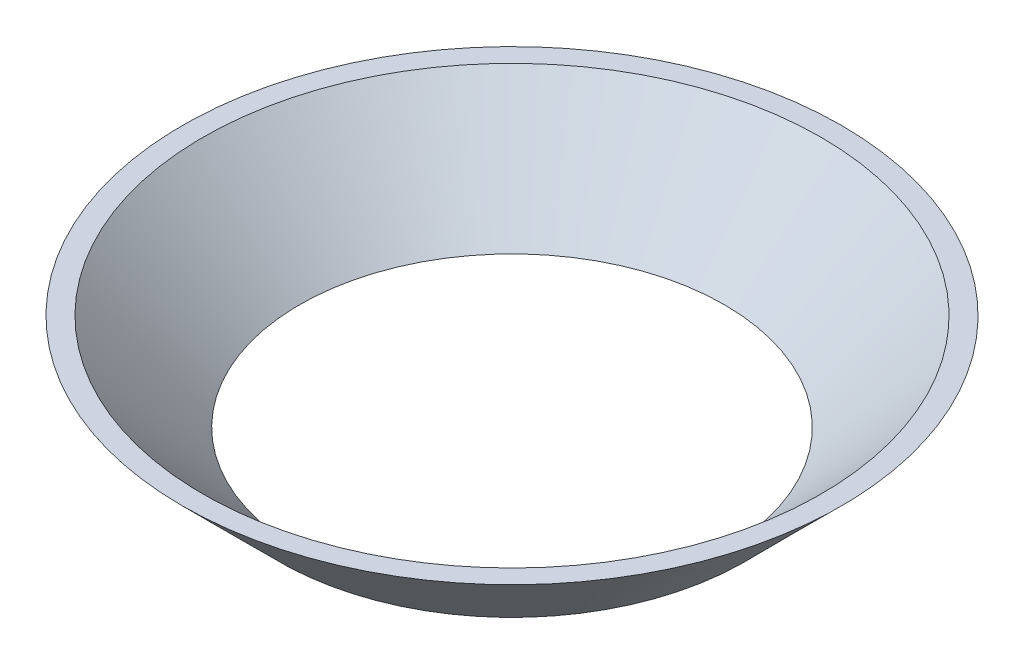
ISO-10303-21;
HEADER;
FILE_DESCRIPTION(('STEP AP214'),'2;1');
FILE_NAME('part.step','',(''),(''),'','','');
FILE_SCHEMA(('AUTOMOTIVE_DESIGN { 1 0 10303 214 1 1 1 1 }'));
ENDSEC;
DATA;
#1=APPLICATION_CONTEXT('core data for automotive mechanical design processes');
#2=APPLICATION_PROTOCOL_DEFINITION('international standard','automotive_design',2000,#1);
#3=PRODUCT_CONTEXT('',#1,'mechanical');
#4=PRODUCT('Part','Part','',(#3));
#5=PRODUCT_RELATED_PRODUCT_CATEGORY('part','',(#4));
#6=PRODUCT_DEFINITION_FORMATION('','',#4);
#7=PRODUCT_DEFINITION_CONTEXT('part definition',#1,'design');
#8=PRODUCT_DEFINITION('design','',#6,#7);
#9=PRODUCT_DEFINITION_SHAPE('','',#8);
#10=(LENGTH_UNIT() NAMED_UNIT(*) SI_UNIT(.MILLI.,.METRE.));
#11=(NAMED_UNIT(*) PLANE_ANGLE_UNIT() SI_UNIT($,.RADIAN.));
#12=(NAMED_UNIT(*) SI_UNIT($,.STERADIAN.) SOLID_ANGLE_UNIT());
#13=UNCERTAINTY_MEASURE_WITH_UNIT(LENGTH_MEASURE(1.E-05),#10,'distance_accuracy_value','');
#14=(GEOMETRIC_REPRESENTATION_CONTEXT(3) GLOBAL_UNCERTAINTY_ASSIGNED_CONTEXT((#13)) GLOBAL_UNIT_ASSIGNED_CONTEXT((#10,
#11,#12)) REPRESENTATION_CONTEXT('',''));
#15=CARTESIAN_POINT('',(0.,0.,0.));
#16=DIRECTION('',(0.,0.,1.));
#17=DIRECTION('',(1.,0.,0.));
#18=AXIS2_PLACEMENT_3D('',#15,#16,#17);
#19=CARTESIAN_POINT('',(29.,0.,0.));
#20=DIRECTION('',(0.,-1.,0.));
#21=DIRECTION('',(0.,0.,-1.));
#22=AXIS2_PLACEMENT_3D('',#19,#20,#21);
#23=PLANE('',#22);
#24=CARTESIAN_POINT('',(0.,0.,0.));
#25=DIRECTION('',(0.,-1.,0.));
#26=DIRECTION('',(0.,0.,-1.));
#27=AXIS2_PLACEMENT_3D('',#24,#25,#26);
#28=CIRCLE('',#27,31.8);
#29=CARTESIAN_POINT('',(0.,0.,-31.8));
#30=VERTEX_POINT('',#29);
#31=EDGE_CURVE('E10',#30,#30,#28,.T.);
#32=ORIENTED_EDGE('',*,*,#31,.T.);
#33=EDGE_LOOP('',(#32));
#34=FACE_BOUND('',#33,.T.);
#35=CARTESIAN_POINT('',(0.,0.,0.));
#36=DIRECTION('',(0.,-1.,0.));
#37=DIRECTION('',(0.,0.,-1.));
#38=AXIS2_PLACEMENT_3D('',#35,#36,#37);
#39=CIRCLE('',#38,29.);
#40=CARTESIAN_POINT('',(0.,0.,-29.));
#41=VERTEX_POINT('',#40);
#42=EDGE_CURVE('E45',#41,#41,#39,.T.);
#43=ORIENTED_EDGE('',*,*,#42,.F.);
#44=EDGE_LOOP('',(#43));
#45=FACE_BOUND('',#44,.T.);
#46=ADVANCED_FACE('F31',(#34,#45),#23,.T.);
#47=CARTESIAN_POINT('',(0.,0.,0.));
#48=DIRECTION('',(0.,1.,0.));
#49=DIRECTION('',(0.,0.,1.));
#50=AXIS2_PLACEMENT_3D('',#47,#48,#49);
#51=CONICAL_SURFACE('',#50,31.8,0.785398163397442);
#52=CARTESIAN_POINT('',(0.,13.2000000000001,0.));
#53=DIRECTION('',(0.,-1.,0.));
#54=DIRECTION('',(0.,0.,-1.));
#55=AXIS2_PLACEMENT_3D('',#52,#53,#54);
#56=CIRCLE('',#55,45.);
#57=CARTESIAN_POINT('',(0.,13.2000000000001,-45.));
#58=VERTEX_POINT('',#57);
#59=EDGE_CURVE('E37',#58,#58,#56,.T.);
#60=ORIENTED_EDGE('',*,*,#59,.T.);
#61=EDGE_LOOP('',(#60));
#62=FACE_BOUND('',#61,.T.);
#63=ORIENTED_EDGE('',*,*,#31,.F.);
#64=EDGE_LOOP('',(#63));
#65=FACE_BOUND('',#64,.T.);
#66=ADVANCED_FACE('F55',(#62,#65),#51,.T.);
#67=CARTESIAN_POINT('',(45.,13.2000000000001,0.));
#68=DIRECTION('',(0.,1.,0.));
#69=DIRECTION('',(0.,0.,1.));
#70=AXIS2_PLACEMENT_3D('',#67,#68,#69);
#71=PLANE('',#70);
#72=CARTESIAN_POINT('',(0.,13.2000000000001,0.));
#73=DIRECTION('',(0.,-1.,0.));
#74=DIRECTION('',(0.,0.,-1.));
#75=AXIS2_PLACEMENT_3D('',#72,#73,#74);
#76=CIRCLE('',#75,42.2);
#77=CARTESIAN_POINT('',(0.,13.2000000000001,-42.2));
#78=VERTEX_POINT('',#77);
#79=EDGE_CURVE('E41',#78,#78,#76,.T.);
#80=ORIENTED_EDGE('',*,*,#79,.T.);
#81=EDGE_LOOP('',(#80));
#82=FACE_BOUND('',#81,.T.);
#83=ORIENTED_EDGE('',*,*,#59,.F.);
#84=EDGE_LOOP('',(#83));
#85=FACE_BOUND('',#84,.T.);
#86=ADVANCED_FACE('F59',(#82,#85),#71,.T.);
#87=CARTESIAN_POINT('',(0.,13.2000000000001,0.));
#88=DIRECTION('',(0.,1.,0.));
#89=DIRECTION('',(0.,0.,1.));
#90=AXIS2_PLACEMENT_3D('',#87,#88,#89);
#91=CONICAL_SURFACE('',#90,42.2,0.785398163397443);
#92=ORIENTED_EDGE('',*,*,#42,.T.);
#93=EDGE_LOOP('',(#92));
#94=FACE_BOUND('',#93,.T.);
#95=ORIENTED_EDGE('',*,*,#79,.F.);
#96=EDGE_LOOP('',(#95));
#97=FACE_BOUND('',#96,.T.);
#98=ADVANCED_FACE('F51',(#94,#97),#91,.F.);
#99=CLOSED_SHELL('',(#46,#66,#86,#98));
#100=MANIFOLD_SOLID_BREP('B2',#99);
#101=ADVANCED_BREP_SHAPE_REPRESENTATION('',(#18,#100),#14);
#102=SHAPE_DEFINITION_REPRESENTATION(#9,#101);
ENDSEC;
END-ISO-10303-21;
